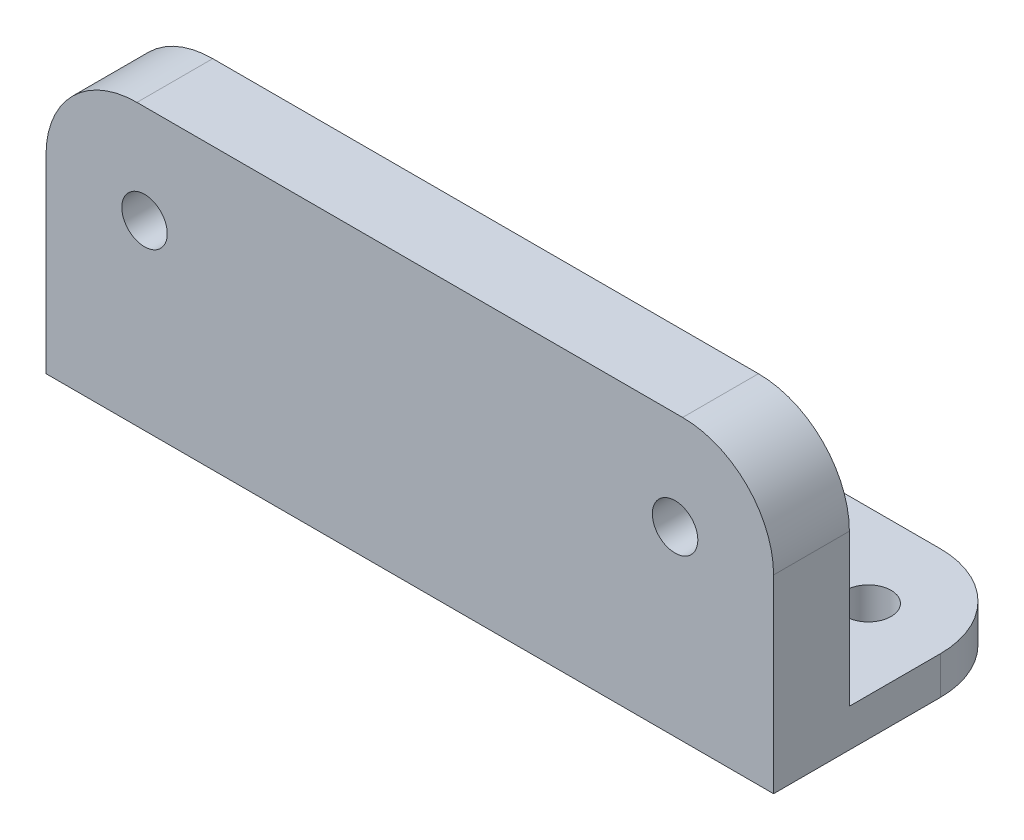
ISO-10303-21;
HEADER;
FILE_DESCRIPTION(('STEP AP214'),'2;1');
FILE_NAME('part.step','',(''),(''),'','','');
FILE_SCHEMA(('AUTOMOTIVE_DESIGN { 1 0 10303 214 1 1 1 1 }'));
ENDSEC;
DATA;
#1=APPLICATION_CONTEXT('core data for automotive mechanical design processes');
#2=APPLICATION_PROTOCOL_DEFINITION('international standard','automotive_design',2000,#1);
#3=PRODUCT_CONTEXT('',#1,'mechanical');
#4=PRODUCT('Part','Part','',(#3));
#5=PRODUCT_RELATED_PRODUCT_CATEGORY('part','',(#4));
#6=PRODUCT_DEFINITION_FORMATION('','',#4);
#7=PRODUCT_DEFINITION_CONTEXT('part definition',#1,'design');
#8=PRODUCT_DEFINITION('design','',#6,#7);
#9=PRODUCT_DEFINITION_SHAPE('','',#8);
#10=(LENGTH_UNIT() NAMED_UNIT(*) SI_UNIT(.MILLI.,.METRE.));
#11=(NAMED_UNIT(*) PLANE_ANGLE_UNIT() SI_UNIT($,.RADIAN.));
#12=(NAMED_UNIT(*) SI_UNIT($,.STERADIAN.) SOLID_ANGLE_UNIT());
#13=UNCERTAINTY_MEASURE_WITH_UNIT(LENGTH_MEASURE(1.E-05),#10,'distance_accuracy_value','');
#14=(GEOMETRIC_REPRESENTATION_CONTEXT(3) GLOBAL_UNCERTAINTY_ASSIGNED_CONTEXT((#13)) GLOBAL_UNIT_ASSIGNED_CONTEXT((#10,
#11,#12)) REPRESENTATION_CONTEXT('',''));
#15=CARTESIAN_POINT('',(0.,0.,0.));
#16=DIRECTION('',(0.,0.,1.));
#17=DIRECTION('',(1.,0.,0.));
#18=AXIS2_PLACEMENT_3D('',#15,#16,#17);
#19=CARTESIAN_POINT('',(24.,2.5,-8.5));
#20=DIRECTION('',(-1.,0.,0.));
#21=DIRECTION('',(0.,0.,1.));
#22=AXIS2_PLACEMENT_3D('',#19,#20,#21);
#23=PLANE('',#22);
#24=DIRECTION('',(0.,-1.,0.));
#25=VECTOR('',#24,1.);
#26=CARTESIAN_POINT('',(24.,18.5,3.5));
#27=LINE('',#26,#25);
#28=CARTESIAN_POINT('',(24.,12.5,3.5));
#29=VERTEX_POINT('',#28);
#30=CARTESIAN_POINT('',(24.,2.5,3.5));
#31=VERTEX_POINT('',#30);
#32=EDGE_CURVE('E131',#29,#31,#27,.T.);
#33=ORIENTED_EDGE('',*,*,#32,.F.);
#34=DIRECTION('',(0.,0.,-1.));
#35=VECTOR('',#34,1.);
#36=CARTESIAN_POINT('',(24.,12.5,-8.5));
#37=LINE('',#36,#35);
#38=CARTESIAN_POINT('',(24.,12.5,8.5));
#39=VERTEX_POINT('',#38);
#40=EDGE_CURVE('E217',#29,#39,#37,.F.);
#41=ORIENTED_EDGE('',*,*,#40,.T.);
#42=DIRECTION('',(0.,-1.,0.));
#43=VECTOR('',#42,1.);
#44=CARTESIAN_POINT('',(24.,2.5,8.5));
#45=LINE('',#44,#43);
#46=CARTESIAN_POINT('',(24.,0.,8.5));
#47=VERTEX_POINT('',#46);
#48=EDGE_CURVE('E120',#39,#47,#45,.T.);
#49=ORIENTED_EDGE('',*,*,#48,.T.);
#50=DIRECTION('',(0.,0.,-1.));
#51=VECTOR('',#50,1.);
#52=CARTESIAN_POINT('',(24.,0.,-8.5));
#53=LINE('',#52,#51);
#54=CARTESIAN_POINT('',(24.,0.,-2.5));
#55=VERTEX_POINT('',#54);
#56=EDGE_CURVE('E160',#47,#55,#53,.T.);
#57=ORIENTED_EDGE('',*,*,#56,.T.);
#58=DIRECTION('',(0.,-1.,0.));
#59=VECTOR('',#58,1.);
#60=CARTESIAN_POINT('',(24.,2.5,-2.5));
#61=LINE('',#60,#59);
#62=CARTESIAN_POINT('',(24.,2.5,-2.5));
#63=VERTEX_POINT('',#62);
#64=EDGE_CURVE('E215',#55,#63,#61,.F.);
#65=ORIENTED_EDGE('',*,*,#64,.T.);
#66=DIRECTION('',(0.,0.,-1.));
#67=VECTOR('',#66,1.);
#68=CARTESIAN_POINT('',(24.,2.5,-8.5));
#69=LINE('',#68,#67);
#70=EDGE_CURVE('E148',#31,#63,#69,.T.);
#71=ORIENTED_EDGE('',*,*,#70,.F.);
#72=EDGE_LOOP('',(#33,#41,#49,#57,#65,#71));
#73=FACE_BOUND('',#72,.T.);
#74=ADVANCED_FACE('F34',(#73),#23,.F.);
#75=CARTESIAN_POINT('',(-24.,2.5,-8.5));
#76=DIRECTION('',(0.,0.,1.));
#77=DIRECTION('',(1.,0.,0.));
#78=AXIS2_PLACEMENT_3D('',#75,#76,#77);
#79=PLANE('',#78);
#80=DIRECTION('',(-1.,0.,0.));
#81=VECTOR('',#80,1.);
#82=CARTESIAN_POINT('',(-24.,0.,-8.5));
#83=LINE('',#82,#81);
#84=CARTESIAN_POINT('',(18.,0.,-8.5));
#85=VERTEX_POINT('',#84);
#86=CARTESIAN_POINT('',(-18.,0.,-8.5));
#87=VERTEX_POINT('',#86);
#88=EDGE_CURVE('E179',#85,#87,#83,.T.);
#89=ORIENTED_EDGE('',*,*,#88,.T.);
#90=DIRECTION('',(0.,-1.,0.));
#91=VECTOR('',#90,1.);
#92=CARTESIAN_POINT('',(-18.,2.5,-8.5));
#93=LINE('',#92,#91);
#94=CARTESIAN_POINT('',(-18.,2.5,-8.5));
#95=VERTEX_POINT('',#94);
#96=EDGE_CURVE('E49',#87,#95,#93,.F.);
#97=ORIENTED_EDGE('',*,*,#96,.T.);
#98=DIRECTION('',(-1.,0.,0.));
#99=VECTOR('',#98,1.);
#100=CARTESIAN_POINT('',(-24.,2.5,-8.5));
#101=LINE('',#100,#99);
#102=CARTESIAN_POINT('',(18.,2.5,-8.5));
#103=VERTEX_POINT('',#102);
#104=EDGE_CURVE('E121',#103,#95,#101,.T.);
#105=ORIENTED_EDGE('',*,*,#104,.F.);
#106=DIRECTION('',(0.,-1.,0.));
#107=VECTOR('',#106,1.);
#108=CARTESIAN_POINT('',(18.,2.5,-8.5));
#109=LINE('',#108,#107);
#110=EDGE_CURVE('E173',#103,#85,#109,.T.);
#111=ORIENTED_EDGE('',*,*,#110,.T.);
#112=EDGE_LOOP('',(#89,#97,#105,#111));
#113=FACE_BOUND('',#112,.T.);
#114=ADVANCED_FACE('F178',(#113),#79,.F.);
#115=CARTESIAN_POINT('',(-24.,2.5,-8.5));
#116=DIRECTION('',(1.,0.,0.));
#117=DIRECTION('',(0.,0.,-1.));
#118=AXIS2_PLACEMENT_3D('',#115,#116,#117);
#119=PLANE('',#118);
#120=DIRECTION('',(0.,-1.,0.));
#121=VECTOR('',#120,1.);
#122=CARTESIAN_POINT('',(-24.,2.5,8.5));
#123=LINE('',#122,#121);
#124=CARTESIAN_POINT('',(-24.,12.5,8.5));
#125=VERTEX_POINT('',#124);
#126=CARTESIAN_POINT('',(-24.,0.,8.5));
#127=VERTEX_POINT('',#126);
#128=EDGE_CURVE('E192',#125,#127,#123,.T.);
#129=ORIENTED_EDGE('',*,*,#128,.F.);
#130=DIRECTION('',(0.,0.,1.));
#131=VECTOR('',#130,1.);
#132=CARTESIAN_POINT('',(-24.,12.5,-8.5));
#133=LINE('',#132,#131);
#134=CARTESIAN_POINT('',(-24.,12.5,3.5));
#135=VERTEX_POINT('',#134);
#136=EDGE_CURVE('E128',#125,#135,#133,.F.);
#137=ORIENTED_EDGE('',*,*,#136,.T.);
#138=DIRECTION('',(0.,-1.,0.));
#139=VECTOR('',#138,1.);
#140=CARTESIAN_POINT('',(-24.,18.5,3.5));
#141=LINE('',#140,#139);
#142=CARTESIAN_POINT('',(-24.,2.5,3.5));
#143=VERTEX_POINT('',#142);
#144=EDGE_CURVE('E124',#135,#143,#141,.T.);
#145=ORIENTED_EDGE('',*,*,#144,.T.);
#146=DIRECTION('',(0.,0.,1.));
#147=VECTOR('',#146,1.);
#148=CARTESIAN_POINT('',(-24.,2.5,-8.5));
#149=LINE('',#148,#147);
#150=CARTESIAN_POINT('',(-24.,2.5,-2.5));
#151=VERTEX_POINT('',#150);
#152=EDGE_CURVE('E110',#151,#143,#149,.T.);
#153=ORIENTED_EDGE('',*,*,#152,.F.);
#154=DIRECTION('',(0.,-1.,0.));
#155=VECTOR('',#154,1.);
#156=CARTESIAN_POINT('',(-24.,2.5,-2.5));
#157=LINE('',#156,#155);
#158=CARTESIAN_POINT('',(-24.,0.,-2.5));
#159=VERTEX_POINT('',#158);
#160=EDGE_CURVE('E166',#151,#159,#157,.T.);
#161=ORIENTED_EDGE('',*,*,#160,.T.);
#162=DIRECTION('',(0.,0.,1.));
#163=VECTOR('',#162,1.);
#164=CARTESIAN_POINT('',(-24.,0.,-8.5));
#165=LINE('',#164,#163);
#166=EDGE_CURVE('E186',#159,#127,#165,.T.);
#167=ORIENTED_EDGE('',*,*,#166,.T.);
#168=EDGE_LOOP('',(#129,#137,#145,#153,#161,#167));
#169=FACE_BOUND('',#168,.T.);
#170=ADVANCED_FACE('F126',(#169),#119,.F.);
#171=CARTESIAN_POINT('',(-24.,2.5,8.5));
#172=DIRECTION('',(0.,0.,-1.));
#173=DIRECTION('',(-1.,0.,0.));
#174=AXIS2_PLACEMENT_3D('',#171,#172,#173);
#175=PLANE('',#174);
#176=CARTESIAN_POINT('',(17.5,12.,8.5));
#177=DIRECTION('',(0.,0.,-1.));
#178=DIRECTION('',(-1.,0.,0.));
#179=AXIS2_PLACEMENT_3D('',#176,#177,#178);
#180=CIRCLE('',#179,1.5);
#181=CARTESIAN_POINT('',(16.,12.,8.5));
#182=VERTEX_POINT('',#181);
#183=EDGE_CURVE('E401',#182,#182,#180,.T.);
#184=ORIENTED_EDGE('',*,*,#183,.T.);
#185=EDGE_LOOP('',(#184));
#186=FACE_BOUND('',#185,.T.);
#187=CARTESIAN_POINT('',(-17.5,12.,8.5));
#188=DIRECTION('',(0.,0.,-1.));
#189=DIRECTION('',(-1.,0.,0.));
#190=AXIS2_PLACEMENT_3D('',#187,#188,#189);
#191=CIRCLE('',#190,1.5);
#192=CARTESIAN_POINT('',(-19.,12.,8.5));
#193=VERTEX_POINT('',#192);
#194=EDGE_CURVE('E392',#193,#193,#191,.T.);
#195=ORIENTED_EDGE('',*,*,#194,.T.);
#196=EDGE_LOOP('',(#195));
#197=FACE_BOUND('',#196,.T.);
#198=ORIENTED_EDGE('',*,*,#48,.F.);
#199=CARTESIAN_POINT('',(18.,12.5,8.5));
#200=DIRECTION('',(0.,0.,-1.));
#201=DIRECTION('',(-1.,0.,0.));
#202=AXIS2_PLACEMENT_3D('',#199,#200,#201);
#203=CIRCLE('',#202,6.);
#204=CARTESIAN_POINT('',(18.,18.5,8.5));
#205=VERTEX_POINT('',#204);
#206=EDGE_CURVE('E164',#39,#205,#203,.F.);
#207=ORIENTED_EDGE('',*,*,#206,.T.);
#208=DIRECTION('',(1.,0.,0.));
#209=VECTOR('',#208,1.);
#210=CARTESIAN_POINT('',(-24.,18.5,8.5));
#211=LINE('',#210,#209);
#212=CARTESIAN_POINT('',(-18.,18.5,8.5));
#213=VERTEX_POINT('',#212);
#214=EDGE_CURVE('E137',#213,#205,#211,.T.);
#215=ORIENTED_EDGE('',*,*,#214,.F.);
#216=CARTESIAN_POINT('',(-18.,12.5,8.5));
#217=DIRECTION('',(0.,0.,-1.));
#218=DIRECTION('',(-1.,0.,0.));
#219=AXIS2_PLACEMENT_3D('',#216,#217,#218);
#220=CIRCLE('',#219,6.);
#221=EDGE_CURVE('E218',#213,#125,#220,.F.);
#222=ORIENTED_EDGE('',*,*,#221,.T.);
#223=ORIENTED_EDGE('',*,*,#128,.T.);
#224=DIRECTION('',(1.,0.,0.));
#225=VECTOR('',#224,1.);
#226=CARTESIAN_POINT('',(-24.,0.,8.5));
#227=LINE('',#226,#225);
#228=EDGE_CURVE('E187',#127,#47,#227,.T.);
#229=ORIENTED_EDGE('',*,*,#228,.T.);
#230=EDGE_LOOP('',(#198,#207,#215,#222,#223,#229));
#231=FACE_BOUND('',#230,.T.);
#232=ADVANCED_FACE('F221',(#186,#197,#231),#175,.F.);
#233=CARTESIAN_POINT('',(0.,2.5,0.));
#234=DIRECTION('',(0.,1.,0.));
#235=DIRECTION('',(0.,0.,1.));
#236=AXIS2_PLACEMENT_3D('',#233,#234,#235);
#237=PLANE('',#236);
#238=CARTESIAN_POINT('',(-18.75,2.5,-3.));
#239=DIRECTION('',(0.,1.,0.));
#240=DIRECTION('',(0.,0.,-1.));
#241=AXIS2_PLACEMENT_3D('',#238,#239,#240);
#242=CIRCLE('',#241,1.5);
#243=CARTESIAN_POINT('',(-18.75,2.5,-4.5));
#244=VERTEX_POINT('',#243);
#245=EDGE_CURVE('E388',#244,#244,#242,.T.);
#246=ORIENTED_EDGE('',*,*,#245,.F.);
#247=EDGE_LOOP('',(#246));
#248=FACE_BOUND('',#247,.T.);
#249=CARTESIAN_POINT('',(18.75,2.5,-3.00000000000001));
#250=DIRECTION('',(0.,1.,0.));
#251=DIRECTION('',(0.,0.,1.));
#252=AXIS2_PLACEMENT_3D('',#249,#250,#251);
#253=CIRCLE('',#252,1.5);
#254=CARTESIAN_POINT('',(18.75,2.5,-1.50000000000001));
#255=VERTEX_POINT('',#254);
#256=EDGE_CURVE('E143',#255,#255,#253,.T.);
#257=ORIENTED_EDGE('',*,*,#256,.F.);
#258=EDGE_LOOP('',(#257));
#259=FACE_BOUND('',#258,.T.);
#260=ORIENTED_EDGE('',*,*,#104,.T.);
#261=CARTESIAN_POINT('',(-18.,2.5,-2.5));
#262=DIRECTION('',(0.,1.,0.));
#263=DIRECTION('',(0.,0.,1.));
#264=AXIS2_PLACEMENT_3D('',#261,#262,#263);
#265=CIRCLE('',#264,6.);
#266=EDGE_CURVE('E11',#95,#151,#265,.T.);
#267=ORIENTED_EDGE('',*,*,#266,.T.);
#268=ORIENTED_EDGE('',*,*,#152,.T.);
#269=DIRECTION('',(-1.,0.,0.));
#270=VECTOR('',#269,1.);
#271=CARTESIAN_POINT('',(-24.,2.5,3.5));
#272=LINE('',#271,#270);
#273=EDGE_CURVE('E114',#31,#143,#272,.T.);
#274=ORIENTED_EDGE('',*,*,#273,.F.);
#275=ORIENTED_EDGE('',*,*,#70,.T.);
#276=CARTESIAN_POINT('',(18.,2.5,-2.5));
#277=DIRECTION('',(0.,1.,0.));
#278=DIRECTION('',(0.,0.,1.));
#279=AXIS2_PLACEMENT_3D('',#276,#277,#278);
#280=CIRCLE('',#279,6.);
#281=EDGE_CURVE('E42',#63,#103,#280,.T.);
#282=ORIENTED_EDGE('',*,*,#281,.T.);
#283=EDGE_LOOP('',(#260,#267,#268,#274,#275,#282));
#284=FACE_BOUND('',#283,.T.);
#285=ADVANCED_FACE('F112',(#248,#259,#284),#237,.T.);
#286=CARTESIAN_POINT('',(0.,0.,0.));
#287=DIRECTION('',(0.,1.,0.));
#288=DIRECTION('',(0.,0.,1.));
#289=AXIS2_PLACEMENT_3D('',#286,#287,#288);
#290=PLANE('',#289);
#291=CARTESIAN_POINT('',(-18.75,0.,-3.));
#292=DIRECTION('',(0.,1.,0.));
#293=DIRECTION('',(0.,0.,1.));
#294=AXIS2_PLACEMENT_3D('',#291,#292,#293);
#295=CIRCLE('',#294,1.5);
#296=CARTESIAN_POINT('',(-18.75,0.,-1.5));
#297=VERTEX_POINT('',#296);
#298=EDGE_CURVE('E208',#297,#297,#295,.T.);
#299=ORIENTED_EDGE('',*,*,#298,.T.);
#300=EDGE_LOOP('',(#299));
#301=FACE_BOUND('',#300,.T.);
#302=CARTESIAN_POINT('',(18.75,0.,-3.00000000000001));
#303=DIRECTION('',(0.,1.,0.));
#304=DIRECTION('',(0.,0.,1.));
#305=AXIS2_PLACEMENT_3D('',#302,#303,#304);
#306=CIRCLE('',#305,1.5);
#307=CARTESIAN_POINT('',(18.75,0.,-1.50000000000001));
#308=VERTEX_POINT('',#307);
#309=EDGE_CURVE('E138',#308,#308,#306,.T.);
#310=ORIENTED_EDGE('',*,*,#309,.T.);
#311=EDGE_LOOP('',(#310));
#312=FACE_BOUND('',#311,.T.);
#313=ORIENTED_EDGE('',*,*,#166,.F.);
#314=CARTESIAN_POINT('',(-18.,0.,-2.5));
#315=DIRECTION('',(0.,1.,0.));
#316=DIRECTION('',(0.,0.,1.));
#317=AXIS2_PLACEMENT_3D('',#314,#315,#316);
#318=CIRCLE('',#317,6.);
#319=EDGE_CURVE('E171',#159,#87,#318,.F.);
#320=ORIENTED_EDGE('',*,*,#319,.T.);
#321=ORIENTED_EDGE('',*,*,#88,.F.);
#322=CARTESIAN_POINT('',(18.,0.,-2.5));
#323=DIRECTION('',(0.,1.,0.));
#324=DIRECTION('',(0.,0.,1.));
#325=AXIS2_PLACEMENT_3D('',#322,#323,#324);
#326=CIRCLE('',#325,6.);
#327=EDGE_CURVE('E169',#85,#55,#326,.F.);
#328=ORIENTED_EDGE('',*,*,#327,.T.);
#329=ORIENTED_EDGE('',*,*,#56,.F.);
#330=ORIENTED_EDGE('',*,*,#228,.F.);
#331=EDGE_LOOP('',(#313,#320,#321,#328,#329,#330));
#332=FACE_BOUND('',#331,.T.);
#333=ADVANCED_FACE('F183',(#301,#312,#332),#290,.F.);
#334=CARTESIAN_POINT('',(-24.,18.5,3.5));
#335=DIRECTION('',(0.,0.,1.));
#336=DIRECTION('',(1.,0.,0.));
#337=AXIS2_PLACEMENT_3D('',#334,#335,#336);
#338=PLANE('',#337);
#339=CARTESIAN_POINT('',(17.5,12.,3.5));
#340=DIRECTION('',(0.,0.,-1.));
#341=DIRECTION('',(1.,0.,0.));
#342=AXIS2_PLACEMENT_3D('',#339,#340,#341);
#343=CIRCLE('',#342,1.5);
#344=CARTESIAN_POINT('',(19.,12.,3.5));
#345=VERTEX_POINT('',#344);
#346=EDGE_CURVE('E404',#345,#345,#343,.T.);
#347=ORIENTED_EDGE('',*,*,#346,.F.);
#348=EDGE_LOOP('',(#347));
#349=FACE_BOUND('',#348,.T.);
#350=CARTESIAN_POINT('',(-17.5,12.,3.5));
#351=DIRECTION('',(0.,0.,-1.));
#352=DIRECTION('',(-1.,0.,0.));
#353=AXIS2_PLACEMENT_3D('',#350,#351,#352);
#354=CIRCLE('',#353,1.5);
#355=CARTESIAN_POINT('',(-19.,12.,3.5));
#356=VERTEX_POINT('',#355);
#357=EDGE_CURVE('E396',#356,#356,#354,.T.);
#358=ORIENTED_EDGE('',*,*,#357,.F.);
#359=EDGE_LOOP('',(#358));
#360=FACE_BOUND('',#359,.T.);
#361=DIRECTION('',(-1.,0.,0.));
#362=VECTOR('',#361,1.);
#363=CARTESIAN_POINT('',(-24.,18.5,3.5));
#364=LINE('',#363,#362);
#365=CARTESIAN_POINT('',(18.,18.5,3.5));
#366=VERTEX_POINT('',#365);
#367=CARTESIAN_POINT('',(-18.,18.5,3.5));
#368=VERTEX_POINT('',#367);
#369=EDGE_CURVE('E132',#366,#368,#364,.T.);
#370=ORIENTED_EDGE('',*,*,#369,.F.);
#371=CARTESIAN_POINT('',(18.,12.5,3.5));
#372=DIRECTION('',(0.,0.,1.));
#373=DIRECTION('',(1.,0.,0.));
#374=AXIS2_PLACEMENT_3D('',#371,#372,#373);
#375=CIRCLE('',#374,6.);
#376=EDGE_CURVE('E213',#366,#29,#375,.F.);
#377=ORIENTED_EDGE('',*,*,#376,.T.);
#378=ORIENTED_EDGE('',*,*,#32,.T.);
#379=ORIENTED_EDGE('',*,*,#273,.T.);
#380=ORIENTED_EDGE('',*,*,#144,.F.);
#381=CARTESIAN_POINT('',(-18.,12.5,3.5));
#382=DIRECTION('',(0.,0.,1.));
#383=DIRECTION('',(1.,0.,0.));
#384=AXIS2_PLACEMENT_3D('',#381,#382,#383);
#385=CIRCLE('',#384,6.);
#386=EDGE_CURVE('E205',#135,#368,#385,.F.);
#387=ORIENTED_EDGE('',*,*,#386,.T.);
#388=EDGE_LOOP('',(#370,#377,#378,#379,#380,#387));
#389=FACE_BOUND('',#388,.T.);
#390=ADVANCED_FACE('F135',(#349,#360,#389),#338,.F.);
#391=CARTESIAN_POINT('',(0.,18.5,0.));
#392=DIRECTION('',(0.,-1.,0.));
#393=DIRECTION('',(0.,0.,-1.));
#394=AXIS2_PLACEMENT_3D('',#391,#392,#393);
#395=PLANE('',#394);
#396=ORIENTED_EDGE('',*,*,#214,.T.);
#397=DIRECTION('',(0.,0.,-1.));
#398=VECTOR('',#397,1.);
#399=CARTESIAN_POINT('',(18.,18.5,0.));
#400=LINE('',#399,#398);
#401=EDGE_CURVE('E198',#205,#366,#400,.T.);
#402=ORIENTED_EDGE('',*,*,#401,.T.);
#403=ORIENTED_EDGE('',*,*,#369,.T.);
#404=DIRECTION('',(0.,0.,1.));
#405=VECTOR('',#404,1.);
#406=CARTESIAN_POINT('',(-18.,18.5,0.));
#407=LINE('',#406,#405);
#408=EDGE_CURVE('E194',#368,#213,#407,.T.);
#409=ORIENTED_EDGE('',*,*,#408,.T.);
#410=EDGE_LOOP('',(#396,#402,#403,#409));
#411=FACE_BOUND('',#410,.T.);
#412=ADVANCED_FACE('F225',(#411),#395,.F.);
#413=CARTESIAN_POINT('',(18.75,-17.5,-3.00000000000001));
#414=DIRECTION('',(0.,1.,0.));
#415=DIRECTION('',(0.,0.,1.));
#416=AXIS2_PLACEMENT_3D('',#413,#414,#415);
#417=CYLINDRICAL_SURFACE('',#416,1.5);
#418=ORIENTED_EDGE('',*,*,#256,.T.);
#419=EDGE_LOOP('',(#418));
#420=FACE_BOUND('',#419,.T.);
#421=ORIENTED_EDGE('',*,*,#309,.F.);
#422=EDGE_LOOP('',(#421));
#423=FACE_BOUND('',#422,.T.);
#424=ADVANCED_FACE('F315',(#420,#423),#417,.F.);
#425=CARTESIAN_POINT('',(-18.75,-17.5,-3.));
#426=DIRECTION('',(0.,1.,0.));
#427=DIRECTION('',(0.,0.,1.));
#428=AXIS2_PLACEMENT_3D('',#425,#426,#427);
#429=CYLINDRICAL_SURFACE('',#428,1.5);
#430=ORIENTED_EDGE('',*,*,#245,.T.);
#431=EDGE_LOOP('',(#430));
#432=FACE_BOUND('',#431,.T.);
#433=ORIENTED_EDGE('',*,*,#298,.F.);
#434=EDGE_LOOP('',(#433));
#435=FACE_BOUND('',#434,.T.);
#436=ADVANCED_FACE('F251',(#432,#435),#429,.F.);
#437=CARTESIAN_POINT('',(18.,12.5,0.));
#438=DIRECTION('',(0.,0.,-1.));
#439=DIRECTION('',(-1.,0.,0.));
#440=AXIS2_PLACEMENT_3D('',#437,#438,#439);
#441=CYLINDRICAL_SURFACE('',#440,6.);
#442=ORIENTED_EDGE('',*,*,#206,.F.);
#443=ORIENTED_EDGE('',*,*,#40,.F.);
#444=ORIENTED_EDGE('',*,*,#376,.F.);
#445=ORIENTED_EDGE('',*,*,#401,.F.);
#446=EDGE_LOOP('',(#442,#443,#444,#445));
#447=FACE_BOUND('',#446,.T.);
#448=ADVANCED_FACE('F226',(#447),#441,.T.);
#449=CARTESIAN_POINT('',(-18.,12.5,0.));
#450=DIRECTION('',(0.,0.,1.));
#451=DIRECTION('',(1.,0.,0.));
#452=AXIS2_PLACEMENT_3D('',#449,#450,#451);
#453=CYLINDRICAL_SURFACE('',#452,6.);
#454=ORIENTED_EDGE('',*,*,#386,.F.);
#455=ORIENTED_EDGE('',*,*,#136,.F.);
#456=ORIENTED_EDGE('',*,*,#221,.F.);
#457=ORIENTED_EDGE('',*,*,#408,.F.);
#458=EDGE_LOOP('',(#454,#455,#456,#457));
#459=FACE_BOUND('',#458,.T.);
#460=ADVANCED_FACE('F239',(#459),#453,.T.);
#461=CARTESIAN_POINT('',(-18.,2.5,-2.5));
#462=DIRECTION('',(0.,-1.,0.));
#463=DIRECTION('',(0.,0.,-1.));
#464=AXIS2_PLACEMENT_3D('',#461,#462,#463);
#465=CYLINDRICAL_SURFACE('',#464,6.);
#466=ORIENTED_EDGE('',*,*,#266,.F.);
#467=ORIENTED_EDGE('',*,*,#96,.F.);
#468=ORIENTED_EDGE('',*,*,#319,.F.);
#469=ORIENTED_EDGE('',*,*,#160,.F.);
#470=EDGE_LOOP('',(#466,#467,#468,#469));
#471=FACE_BOUND('',#470,.T.);
#472=ADVANCED_FACE('F231',(#471),#465,.T.);
#473=CARTESIAN_POINT('',(18.,2.5,-2.5));
#474=DIRECTION('',(0.,-1.,0.));
#475=DIRECTION('',(0.,0.,-1.));
#476=AXIS2_PLACEMENT_3D('',#473,#474,#475);
#477=CYLINDRICAL_SURFACE('',#476,6.);
#478=ORIENTED_EDGE('',*,*,#281,.F.);
#479=ORIENTED_EDGE('',*,*,#64,.F.);
#480=ORIENTED_EDGE('',*,*,#327,.F.);
#481=ORIENTED_EDGE('',*,*,#110,.F.);
#482=EDGE_LOOP('',(#478,#479,#480,#481));
#483=FACE_BOUND('',#482,.T.);
#484=ADVANCED_FACE('F36',(#483),#477,.T.);
#485=CARTESIAN_POINT('',(-17.5,12.,23.5));
#486=DIRECTION('',(0.,0.,-1.));
#487=DIRECTION('',(-1.,0.,0.));
#488=AXIS2_PLACEMENT_3D('',#485,#486,#487);
#489=CYLINDRICAL_SURFACE('',#488,1.5);
#490=ORIENTED_EDGE('',*,*,#357,.T.);
#491=EDGE_LOOP('',(#490));
#492=FACE_BOUND('',#491,.T.);
#493=ORIENTED_EDGE('',*,*,#194,.F.);
#494=EDGE_LOOP('',(#493));
#495=FACE_BOUND('',#494,.T.);
#496=ADVANCED_FACE('F230',(#492,#495),#489,.F.);
#497=CARTESIAN_POINT('',(17.5,12.,23.5));
#498=DIRECTION('',(0.,0.,-1.));
#499=DIRECTION('',(-1.,0.,0.));
#500=AXIS2_PLACEMENT_3D('',#497,#498,#499);
#501=CYLINDRICAL_SURFACE('',#500,1.5);
#502=ORIENTED_EDGE('',*,*,#346,.T.);
#503=EDGE_LOOP('',(#502));
#504=FACE_BOUND('',#503,.T.);
#505=ORIENTED_EDGE('',*,*,#183,.F.);
#506=EDGE_LOOP('',(#505));
#507=FACE_BOUND('',#506,.T.);
#508=ADVANCED_FACE('F236',(#504,#507),#501,.F.);
#509=CLOSED_SHELL('',(#74,#114,#170,#232,#285,#333,#390,#412,#424,#436,#448,#460,#472,#484,#496,#508));
#510=MANIFOLD_SOLID_BREP('B2',#509);
#511=ADVANCED_BREP_SHAPE_REPRESENTATION('',(#18,#510),#14);
#512=SHAPE_DEFINITION_REPRESENTATION(#9,#511);
ENDSEC;
END-ISO-10303-21;
